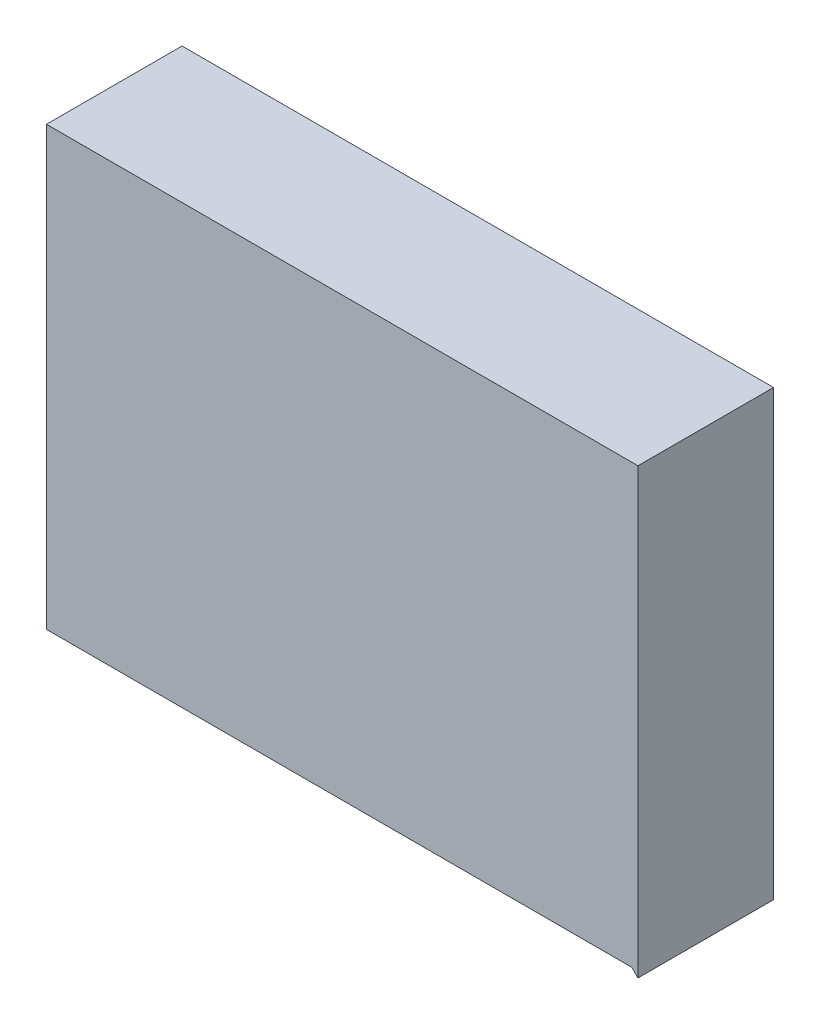
ISO-10303-21;
HEADER;
FILE_DESCRIPTION(('STEP AP214'),'2;1');
FILE_NAME('part.step','',(''),(''),'','','');
FILE_SCHEMA(('AUTOMOTIVE_DESIGN { 1 0 10303 214 1 1 1 1 }'));
ENDSEC;
DATA;
#1=APPLICATION_CONTEXT('core data for automotive mechanical design processes');
#2=APPLICATION_PROTOCOL_DEFINITION('international standard','automotive_design',2000,#1);
#3=PRODUCT_CONTEXT('',#1,'mechanical');
#4=PRODUCT('Part','Part','',(#3));
#5=PRODUCT_RELATED_PRODUCT_CATEGORY('part','',(#4));
#6=PRODUCT_DEFINITION_FORMATION('','',#4);
#7=PRODUCT_DEFINITION_CONTEXT('part definition',#1,'design');
#8=PRODUCT_DEFINITION('design','',#6,#7);
#9=PRODUCT_DEFINITION_SHAPE('','',#8);
#10=(LENGTH_UNIT() NAMED_UNIT(*) SI_UNIT(.MILLI.,.METRE.));
#11=(NAMED_UNIT(*) PLANE_ANGLE_UNIT() SI_UNIT($,.RADIAN.));
#12=(NAMED_UNIT(*) SI_UNIT($,.STERADIAN.) SOLID_ANGLE_UNIT());
#13=UNCERTAINTY_MEASURE_WITH_UNIT(LENGTH_MEASURE(1.E-05),#10,'distance_accuracy_value','');
#14=(GEOMETRIC_REPRESENTATION_CONTEXT(3) GLOBAL_UNCERTAINTY_ASSIGNED_CONTEXT((#13)) GLOBAL_UNIT_ASSIGNED_CONTEXT((#10,
#11,#12)) REPRESENTATION_CONTEXT('',''));
#15=CARTESIAN_POINT('',(0.,0.,0.));
#16=DIRECTION('',(0.,0.,1.));
#17=DIRECTION('',(1.,0.,0.));
#18=AXIS2_PLACEMENT_3D('',#15,#16,#17);
#19=CARTESIAN_POINT('',(-1.20000014,0.90000074,0.5499989));
#20=DIRECTION('',(0.,0.,1.));
#21=DIRECTION('',(1.,0.,0.));
#22=AXIS2_PLACEMENT_3D('',#19,#20,#21);
#23=PLANE('',#22);
#24=DIRECTION('',(0.,1.,0.));
#25=VECTOR('',#24,1.);
#26=CARTESIAN_POINT('',(1.20000014,0.90000074,0.5499989));
#27=LINE('',#26,#25);
#28=CARTESIAN_POINT('',(1.20000014,0.90000074,0.5499989));
#29=VERTEX_POINT('',#28);
#30=CARTESIAN_POINT('',(1.20000014,-0.90000074,0.5499989));
#31=VERTEX_POINT('',#30);
#32=EDGE_CURVE('E87',#29,#31,#27,.F.);
#33=ORIENTED_EDGE('',*,*,#32,.F.);
#34=DIRECTION('',(1.,0.,0.));
#35=VECTOR('',#34,1.);
#36=CARTESIAN_POINT('',(-1.20000014,0.90000074,0.5499989));
#37=LINE('',#36,#35);
#38=CARTESIAN_POINT('',(-1.20000014,0.90000074,0.5499989));
#39=VERTEX_POINT('',#38);
#40=EDGE_CURVE('E76',#39,#29,#37,.T.);
#41=ORIENTED_EDGE('',*,*,#40,.F.);
#42=DIRECTION('',(0.,1.,0.));
#43=VECTOR('',#42,1.);
#44=CARTESIAN_POINT('',(-1.20000014,-0.87499952,0.5499989));
#45=LINE('',#44,#43);
#46=CARTESIAN_POINT('',(-1.20000014,-0.87499952,0.5499989));
#47=VERTEX_POINT('',#46);
#48=EDGE_CURVE('E20',#47,#39,#45,.T.);
#49=ORIENTED_EDGE('',*,*,#48,.F.);
#50=DIRECTION('',(1.,0.,0.));
#51=VECTOR('',#50,1.);
#52=CARTESIAN_POINT('',(1.17499892,-0.87499952,0.5499989));
#53=LINE('',#52,#51);
#54=CARTESIAN_POINT('',(1.17499892,-0.874999520000004,0.5499989));
#55=VERTEX_POINT('',#54);
#56=EDGE_CURVE('E65',#55,#47,#53,.F.);
#57=ORIENTED_EDGE('',*,*,#56,.F.);
#58=DIRECTION('',(0.707106781187048,-0.707106781186048,0.));
#59=VECTOR('',#58,1.);
#60=CARTESIAN_POINT('',(1.20000014,-0.90000074,0.5499989));
#61=LINE('',#60,#59);
#62=EDGE_CURVE('E60',#31,#55,#61,.F.);
#63=ORIENTED_EDGE('',*,*,#62,.F.);
#64=EDGE_LOOP('',(#33,#41,#49,#57,#63));
#65=FACE_BOUND('',#64,.T.);
#66=ADVANCED_FACE('F17',(#65),#23,.T.);
#67=CARTESIAN_POINT('',(-1.20000014,-0.87499952,0.));
#68=DIRECTION('',(-1.,0.,0.));
#69=DIRECTION('',(0.,0.,1.));
#70=AXIS2_PLACEMENT_3D('',#67,#68,#69);
#71=PLANE('',#70);
#72=DIRECTION('',(0.,0.,1.));
#73=VECTOR('',#72,1.);
#74=CARTESIAN_POINT('',(-1.20000014,0.90000074,0.));
#75=LINE('',#74,#73);
#76=CARTESIAN_POINT('',(-1.20000014,0.90000074,0.));
#77=VERTEX_POINT('',#76);
#78=EDGE_CURVE('E91',#77,#39,#75,.T.);
#79=ORIENTED_EDGE('',*,*,#78,.F.);
#80=DIRECTION('',(0.,1.,0.));
#81=VECTOR('',#80,1.);
#82=CARTESIAN_POINT('',(-1.20000014,0.90000074,0.));
#83=LINE('',#82,#81);
#84=CARTESIAN_POINT('',(-1.20000014,-0.87499952,0.));
#85=VERTEX_POINT('',#84);
#86=EDGE_CURVE('E82',#77,#85,#83,.F.);
#87=ORIENTED_EDGE('',*,*,#86,.T.);
#88=DIRECTION('',(0.,0.,-1.));
#89=VECTOR('',#88,1.);
#90=CARTESIAN_POINT('',(-1.20000014,-0.87499952,0.));
#91=LINE('',#90,#89);
#92=EDGE_CURVE('E70',#47,#85,#91,.T.);
#93=ORIENTED_EDGE('',*,*,#92,.F.);
#94=ORIENTED_EDGE('',*,*,#48,.T.);
#95=EDGE_LOOP('',(#79,#87,#93,#94));
#96=FACE_BOUND('',#95,.T.);
#97=ADVANCED_FACE('F81',(#96),#71,.T.);
#98=CARTESIAN_POINT('',(1.17499892,-0.87499952,0.));
#99=DIRECTION('',(0.,-1.,0.));
#100=DIRECTION('',(0.,0.,-1.));
#101=AXIS2_PLACEMENT_3D('',#98,#99,#100);
#102=PLANE('',#101);
#103=ORIENTED_EDGE('',*,*,#92,.T.);
#104=DIRECTION('',(1.,0.,0.));
#105=VECTOR('',#104,1.);
#106=CARTESIAN_POINT('',(-1.20000014,-0.87499952,0.));
#107=LINE('',#106,#105);
#108=CARTESIAN_POINT('',(1.17499892,-0.874999520000004,0.));
#109=VERTEX_POINT('',#108);
#110=EDGE_CURVE('E96',#85,#109,#107,.T.);
#111=ORIENTED_EDGE('',*,*,#110,.T.);
#112=DIRECTION('',(0.,0.,1.));
#113=VECTOR('',#112,1.);
#114=CARTESIAN_POINT('',(1.17499891999998,-0.874999520000018,0.));
#115=LINE('',#114,#113);
#116=EDGE_CURVE('E72',#55,#109,#115,.F.);
#117=ORIENTED_EDGE('',*,*,#116,.F.);
#118=ORIENTED_EDGE('',*,*,#56,.T.);
#119=EDGE_LOOP('',(#103,#111,#117,#118));
#120=FACE_BOUND('',#119,.T.);
#121=ADVANCED_FACE('F67',(#120),#102,.T.);
#122=CARTESIAN_POINT('',(1.20000014,-0.90000074,0.));
#123=DIRECTION('',(-0.707106781186048,-0.707106781187048,0.));
#124=DIRECTION('',(0.707106781187048,-0.707106781186048,0.));
#125=AXIS2_PLACEMENT_3D('',#122,#123,#124);
#126=PLANE('',#125);
#127=ORIENTED_EDGE('',*,*,#116,.T.);
#128=DIRECTION('',(0.707106781186551,-0.707106781186544,0.));
#129=VECTOR('',#128,1.);
#130=CARTESIAN_POINT('',(1.17499892,-0.87499952,0.));
#131=LINE('',#130,#129);
#132=CARTESIAN_POINT('',(1.20000014,-0.90000074,0.));
#133=VERTEX_POINT('',#132);
#134=EDGE_CURVE('E98',#109,#133,#131,.T.);
#135=ORIENTED_EDGE('',*,*,#134,.T.);
#136=DIRECTION('',(0.,0.,-1.));
#137=VECTOR('',#136,1.);
#138=CARTESIAN_POINT('',(1.20000014,-0.90000074,0.));
#139=LINE('',#138,#137);
#140=EDGE_CURVE('E89',#31,#133,#139,.T.);
#141=ORIENTED_EDGE('',*,*,#140,.F.);
#142=ORIENTED_EDGE('',*,*,#62,.T.);
#143=EDGE_LOOP('',(#127,#135,#141,#142));
#144=FACE_BOUND('',#143,.T.);
#145=ADVANCED_FACE('F108',(#144),#126,.T.);
#146=CARTESIAN_POINT('',(1.20000014,0.90000074,0.));
#147=DIRECTION('',(1.,0.,0.));
#148=DIRECTION('',(0.,0.,-1.));
#149=AXIS2_PLACEMENT_3D('',#146,#147,#148);
#150=PLANE('',#149);
#151=ORIENTED_EDGE('',*,*,#140,.T.);
#152=DIRECTION('',(0.,1.,0.));
#153=VECTOR('',#152,1.);
#154=CARTESIAN_POINT('',(1.20000014,0.90000074,0.));
#155=LINE('',#154,#153);
#156=CARTESIAN_POINT('',(1.20000014,0.90000074,0.));
#157=VERTEX_POINT('',#156);
#158=EDGE_CURVE('E26',#133,#157,#155,.T.);
#159=ORIENTED_EDGE('',*,*,#158,.T.);
#160=DIRECTION('',(0.,0.,1.));
#161=VECTOR('',#160,1.);
#162=CARTESIAN_POINT('',(1.20000014,0.90000074,0.));
#163=LINE('',#162,#161);
#164=EDGE_CURVE('E34',#29,#157,#163,.F.);
#165=ORIENTED_EDGE('',*,*,#164,.F.);
#166=ORIENTED_EDGE('',*,*,#32,.T.);
#167=EDGE_LOOP('',(#151,#159,#165,#166));
#168=FACE_BOUND('',#167,.T.);
#169=ADVANCED_FACE('F104',(#168),#150,.T.);
#170=CARTESIAN_POINT('',(-1.20000014,0.90000074,0.));
#171=DIRECTION('',(0.,1.,0.));
#172=DIRECTION('',(0.,0.,1.));
#173=AXIS2_PLACEMENT_3D('',#170,#171,#172);
#174=PLANE('',#173);
#175=ORIENTED_EDGE('',*,*,#164,.T.);
#176=DIRECTION('',(1.,0.,0.));
#177=VECTOR('',#176,1.);
#178=CARTESIAN_POINT('',(-1.20000014,0.90000074,0.));
#179=LINE('',#178,#177);
#180=EDGE_CURVE('E11',#157,#77,#179,.F.);
#181=ORIENTED_EDGE('',*,*,#180,.T.);
#182=ORIENTED_EDGE('',*,*,#78,.T.);
#183=ORIENTED_EDGE('',*,*,#40,.T.);
#184=EDGE_LOOP('',(#175,#181,#182,#183));
#185=FACE_BOUND('',#184,.T.);
#186=ADVANCED_FACE('F116',(#185),#174,.T.);
#187=CARTESIAN_POINT('',(-1.20000014,0.90000074,0.));
#188=DIRECTION('',(0.,0.,1.));
#189=DIRECTION('',(1.,0.,0.));
#190=AXIS2_PLACEMENT_3D('',#187,#188,#189);
#191=PLANE('',#190);
#192=ORIENTED_EDGE('',*,*,#158,.F.);
#193=ORIENTED_EDGE('',*,*,#134,.F.);
#194=ORIENTED_EDGE('',*,*,#110,.F.);
#195=ORIENTED_EDGE('',*,*,#86,.F.);
#196=ORIENTED_EDGE('',*,*,#180,.F.);
#197=EDGE_LOOP('',(#192,#193,#194,#195,#196));
#198=FACE_BOUND('',#197,.T.);
#199=ADVANCED_FACE('F107',(#198),#191,.F.);
#200=CLOSED_SHELL('',(#66,#97,#121,#145,#169,#186,#199));
#201=MANIFOLD_SOLID_BREP('B1',#200);
#202=ADVANCED_BREP_SHAPE_REPRESENTATION('',(#18,#201),#14);
#203=SHAPE_DEFINITION_REPRESENTATION(#9,#202);
ENDSEC;
END-ISO-10303-21;
